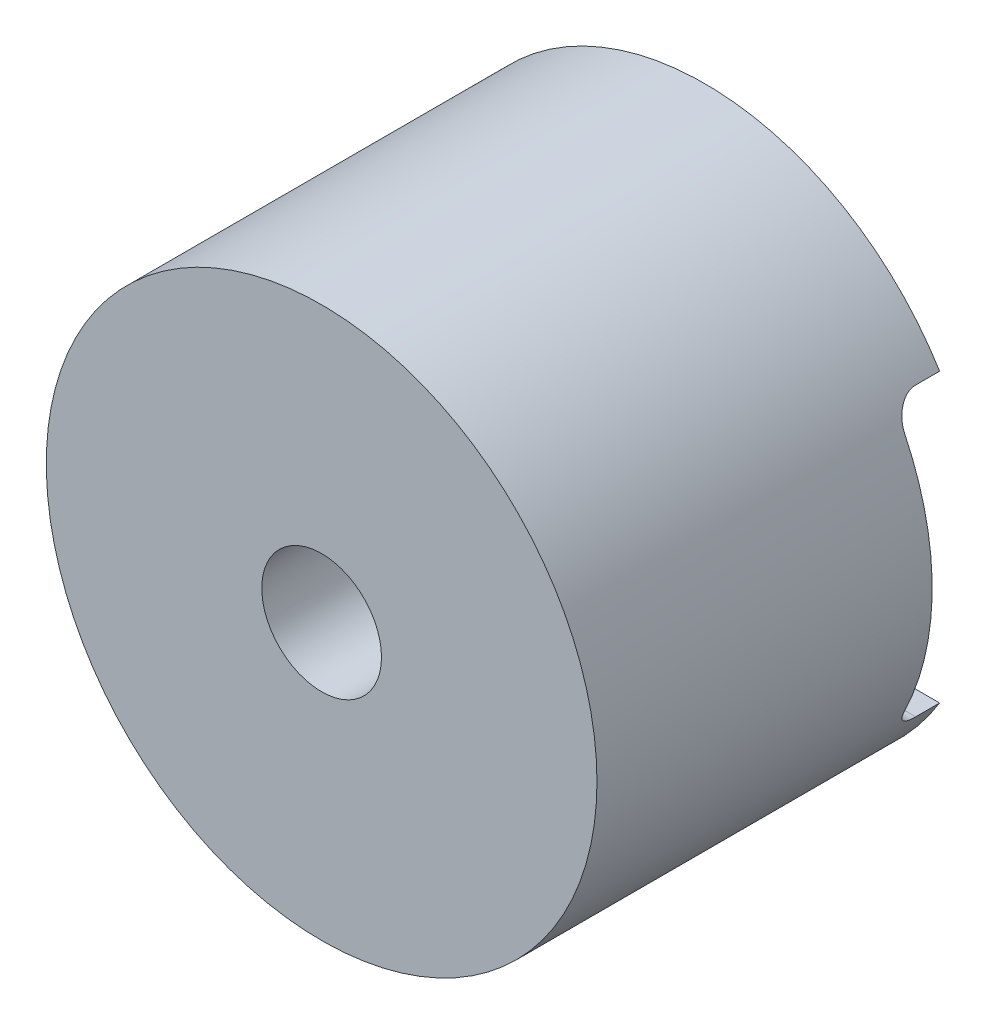
ISO-10303-21;
HEADER;
FILE_DESCRIPTION(('STEP AP214'),'2;1');
FILE_NAME('part.step','',(''),(''),'','','');
FILE_SCHEMA(('AUTOMOTIVE_DESIGN { 1 0 10303 214 1 1 1 1 }'));
ENDSEC;
DATA;
#1=APPLICATION_CONTEXT('core data for automotive mechanical design processes');
#2=APPLICATION_PROTOCOL_DEFINITION('international standard','automotive_design',2000,#1);
#3=PRODUCT_CONTEXT('',#1,'mechanical');
#4=PRODUCT('Part','Part','',(#3));
#5=PRODUCT_RELATED_PRODUCT_CATEGORY('part','',(#4));
#6=PRODUCT_DEFINITION_FORMATION('','',#4);
#7=PRODUCT_DEFINITION_CONTEXT('part definition',#1,'design');
#8=PRODUCT_DEFINITION('design','',#6,#7);
#9=PRODUCT_DEFINITION_SHAPE('','',#8);
#10=(LENGTH_UNIT() NAMED_UNIT(*) SI_UNIT(.MILLI.,.METRE.));
#11=(NAMED_UNIT(*) PLANE_ANGLE_UNIT() SI_UNIT($,.RADIAN.));
#12=(NAMED_UNIT(*) SI_UNIT($,.STERADIAN.) SOLID_ANGLE_UNIT());
#13=UNCERTAINTY_MEASURE_WITH_UNIT(LENGTH_MEASURE(1.E-05),#10,'distance_accuracy_value','');
#14=(GEOMETRIC_REPRESENTATION_CONTEXT(3) GLOBAL_UNCERTAINTY_ASSIGNED_CONTEXT((#13)) GLOBAL_UNIT_ASSIGNED_CONTEXT((#10,
#11,#12)) REPRESENTATION_CONTEXT('',''));
#15=CARTESIAN_POINT('',(0.,0.,0.));
#16=DIRECTION('',(0.,0.,1.));
#17=DIRECTION('',(1.,0.,0.));
#18=AXIS2_PLACEMENT_3D('',#15,#16,#17);
#19=CARTESIAN_POINT('',(0.,0.,1.));
#20=DIRECTION('',(0.,0.,-1.));
#21=DIRECTION('',(-1.,0.,0.));
#22=AXIS2_PLACEMENT_3D('',#19,#20,#21);
#23=PLANE('',#22);
#24=CARTESIAN_POINT('',(0.,0.,1.));
#25=DIRECTION('',(0.,0.,-1.));
#26=DIRECTION('',(-1.,0.,0.));
#27=AXIS2_PLACEMENT_3D('',#24,#25,#26);
#28=CIRCLE('',#27,4.5);
#29=CARTESIAN_POINT('',(3.74165738677394,2.5,1.));
#30=VERTEX_POINT('',#29);
#31=CARTESIAN_POINT('',(3.74165738677394,-2.5,1.));
#32=VERTEX_POINT('',#31);
#33=EDGE_CURVE('E146',#30,#32,#28,.T.);
#34=ORIENTED_EDGE('',*,*,#33,.F.);
#35=DIRECTION('',(1.,0.,0.));
#36=VECTOR('',#35,1.);
#37=CARTESIAN_POINT('',(0.,2.5,1.));
#38=LINE('',#37,#36);
#39=CARTESIAN_POINT('',(5.178078794302,2.5,1.));
#40=VERTEX_POINT('',#39);
#41=EDGE_CURVE('E163',#30,#40,#38,.T.);
#42=ORIENTED_EDGE('',*,*,#41,.T.);
#43=CARTESIAN_POINT('',(0.,0.,1.));
#44=DIRECTION('',(0.,0.,1.));
#45=DIRECTION('',(1.,0.,0.));
#46=AXIS2_PLACEMENT_3D('',#43,#44,#45);
#47=CIRCLE('',#46,5.75);
#48=CARTESIAN_POINT('',(5.178078794302,-2.5,1.));
#49=VERTEX_POINT('',#48);
#50=EDGE_CURVE('E426',#49,#40,#47,.T.);
#51=ORIENTED_EDGE('',*,*,#50,.F.);
#52=DIRECTION('',(-1.,0.,0.));
#53=VECTOR('',#52,1.);
#54=CARTESIAN_POINT('',(0.,-2.5,1.));
#55=LINE('',#54,#53);
#56=EDGE_CURVE('E168',#49,#32,#55,.T.);
#57=ORIENTED_EDGE('',*,*,#56,.T.);
#58=EDGE_LOOP('',(#34,#42,#51,#57));
#59=FACE_BOUND('',#58,.T.);
#60=ADVANCED_FACE('F43',(#59),#23,.T.);
#61=CARTESIAN_POINT('',(0.,0.,0.));
#62=DIRECTION('',(0.,0.,1.));
#63=DIRECTION('',(1.,0.,0.));
#64=AXIS2_PLACEMENT_3D('',#61,#62,#63);
#65=PLANE('',#64);
#66=DIRECTION('',(-1.,0.,0.));
#67=VECTOR('',#66,1.);
#68=CARTESIAN_POINT('',(-6.67958311014207,-3.,0.));
#69=LINE('',#68,#67);
#70=CARTESIAN_POINT('',(4.90535421758715,-3.,0.));
#71=VERTEX_POINT('',#70);
#72=CARTESIAN_POINT('',(3.35410196624968,-3.,0.));
#73=VERTEX_POINT('',#72);
#74=EDGE_CURVE('E254',#71,#73,#69,.T.);
#75=ORIENTED_EDGE('',*,*,#74,.F.);
#76=CARTESIAN_POINT('',(0.,0.,0.));
#77=DIRECTION('',(0.,0.,1.));
#78=DIRECTION('',(1.,0.,0.));
#79=AXIS2_PLACEMENT_3D('',#76,#77,#78);
#80=CIRCLE('',#79,5.75);
#81=CARTESIAN_POINT('',(-4.90535421758715,-3.,0.));
#82=VERTEX_POINT('',#81);
#83=EDGE_CURVE('E256',#82,#71,#80,.T.);
#84=ORIENTED_EDGE('',*,*,#83,.F.);
#85=CARTESIAN_POINT('',(-3.35410196624968,-3.,0.));
#86=VERTEX_POINT('',#85);
#87=EDGE_CURVE('E261',#86,#82,#69,.T.);
#88=ORIENTED_EDGE('',*,*,#87,.F.);
#89=CARTESIAN_POINT('',(0.,0.,0.));
#90=DIRECTION('',(0.,0.,-1.));
#91=DIRECTION('',(-1.,0.,0.));
#92=AXIS2_PLACEMENT_3D('',#89,#90,#91);
#93=CIRCLE('',#92,4.5);
#94=EDGE_CURVE('E259',#73,#86,#93,.T.);
#95=ORIENTED_EDGE('',*,*,#94,.F.);
#96=EDGE_LOOP('',(#75,#84,#88,#95));
#97=FACE_BOUND('',#96,.T.);
#98=ADVANCED_FACE('F241',(#97),#65,.F.);
#99=DIRECTION('',(1.,0.,0.));
#100=VECTOR('',#99,1.);
#101=CARTESIAN_POINT('',(-6.67958311014207,3.,0.));
#102=LINE('',#101,#100);
#103=CARTESIAN_POINT('',(-4.90535421758715,3.,0.));
#104=VERTEX_POINT('',#103);
#105=CARTESIAN_POINT('',(-3.35410196624968,3.,0.));
#106=VERTEX_POINT('',#105);
#107=EDGE_CURVE('E408',#104,#106,#102,.T.);
#108=ORIENTED_EDGE('',*,*,#107,.F.);
#109=CARTESIAN_POINT('',(4.90535421758715,3.,0.));
#110=VERTEX_POINT('',#109);
#111=EDGE_CURVE('E271',#110,#104,#80,.T.);
#112=ORIENTED_EDGE('',*,*,#111,.F.);
#113=CARTESIAN_POINT('',(3.35410196624968,3.,0.));
#114=VERTEX_POINT('',#113);
#115=EDGE_CURVE('E257',#114,#110,#102,.T.);
#116=ORIENTED_EDGE('',*,*,#115,.F.);
#117=EDGE_CURVE('E275',#106,#114,#93,.T.);
#118=ORIENTED_EDGE('',*,*,#117,.F.);
#119=EDGE_LOOP('',(#108,#112,#116,#118));
#120=FACE_BOUND('',#119,.T.);
#121=ADVANCED_FACE('F242',(#120),#65,.F.);
#122=CARTESIAN_POINT('',(0.,0.,8.));
#123=DIRECTION('',(0.,0.,-1.));
#124=DIRECTION('',(-1.,0.,0.));
#125=AXIS2_PLACEMENT_3D('',#122,#123,#124);
#126=CYLINDRICAL_SURFACE('',#125,5.75);
#127=ORIENTED_EDGE('',*,*,#111,.T.);
#128=DIRECTION('',(0.,0.,-1.));
#129=VECTOR('',#128,1.);
#130=CARTESIAN_POINT('',(-4.90535421758715,3.,8.));
#131=LINE('',#130,#129);
#132=CARTESIAN_POINT('',(-4.90535421758715,3.,0.5));
#133=VERTEX_POINT('',#132);
#134=EDGE_CURVE('E423',#104,#133,#131,.F.);
#135=ORIENTED_EDGE('',*,*,#134,.T.);
#136=CARTESIAN_POINT('',(-4.90535421758715,3.,0.5));
#137=CARTESIAN_POINT('',(-4.90532801108761,3.00003352669518,0.525346957454746));
#138=CARTESIAN_POINT('',(-4.90653149160759,2.99807509659698,0.550658668009895));
#139=CARTESIAN_POINT('',(-4.91118382175395,2.99045275931379,0.600380359194122));
#140=CARTESIAN_POINT('',(-4.9146213725958,2.98480749753717,0.624794227696451));
#141=CARTESIAN_POINT('',(-4.92352620251217,2.97009403840713,0.672128405260374));
#142=CARTESIAN_POINT('',(-4.92899098179319,2.96103005647845,0.695050513076731));
#143=CARTESIAN_POINT('',(-4.94163598151607,2.9398786340639,0.738958164216219));
#144=CARTESIAN_POINT('',(-4.94881803627487,2.92778795994783,0.759941603284304));
#145=CARTESIAN_POINT('',(-4.96505501815774,2.90017239268279,0.800847079910836));
#146=CARTESIAN_POINT('',(-4.97419925988442,2.88447946869383,0.820619618160841));
#147=CARTESIAN_POINT('',(-4.99365578227061,2.85066358617449,0.857292388887544));
#148=CARTESIAN_POINT('',(-5.00396842989955,2.83253986385594,0.874191714763773));
#149=CARTESIAN_POINT('',(-5.02690753950655,2.7916521749742,0.907086624891879));
#150=CARTESIAN_POINT('',(-5.03965642829471,2.76859334178177,0.922630658255236));
#151=CARTESIAN_POINT('',(-5.06578122197767,2.72049855944174,0.94960160063678));
#152=CARTESIAN_POINT('',(-5.07915754705472,2.69546127745472,0.961025704815717));
#153=CARTESIAN_POINT('',(-5.10689053157317,2.6425557908318,0.980115436507868));
#154=CARTESIAN_POINT('',(-5.12126071003556,2.61460763370695,0.987540445799408));
#155=CARTESIAN_POINT('',(-5.14986553962247,2.55781592957867,0.997482455196793));
#156=CARTESIAN_POINT('',(-5.16410029504209,2.5289731594334,1.00000359881657));
#157=CARTESIAN_POINT('',(-5.178078794302,2.5,1.));
#158=B_SPLINE_CURVE_WITH_KNOTS('',3,(#136,#137,#138,#139,#140,#141,#142,#143,#144,#145,#146,
#147,#148,#149,#150,#151,#152,#153,#154,#155,#156,#157),.UNSPECIFIED.,.F.,.F.,(4,2,2,2,2,2,2,2,
2,2,4),(0.,0.0758813183458636,0.151381823283267,0.22678953568167,0.302278157914572,
0.382509261613673,0.462765634278484,0.554169315106722,0.645635106420526,0.742119550217568,
0.838522434153712),.UNSPECIFIED.);
#159=CARTESIAN_POINT('',(-5.178078794302,2.5,1.));
#160=VERTEX_POINT('',#159);
#161=EDGE_CURVE('E160',#133,#160,#158,.T.);
#162=ORIENTED_EDGE('',*,*,#161,.T.);
#163=CARTESIAN_POINT('',(-5.178078794302,-2.5,1.));
#164=VERTEX_POINT('',#163);
#165=EDGE_CURVE('E162',#160,#164,#47,.T.);
#166=ORIENTED_EDGE('',*,*,#165,.T.);
#167=CARTESIAN_POINT('',(-5.178078794302,-2.5,1.));
#168=CARTESIAN_POINT('',(-5.1629507506291,-2.53136119370427,1.00000350042496));
#169=CARTESIAN_POINT('',(-5.14752127052535,-2.56256503398749,0.997050302461032));
#170=CARTESIAN_POINT('',(-5.11653000555348,-2.62388377874402,0.985414373331441));
#171=CARTESIAN_POINT('',(-5.10096804739912,-2.65399684525296,0.97672240654602));
#172=CARTESIAN_POINT('',(-5.07022738545424,-2.71226661048219,0.953788787231853));
#173=CARTESIAN_POINT('',(-5.05504886003746,-2.74042240897112,0.939544600641067));
#174=CARTESIAN_POINT('',(-5.02568022277324,-2.79391595809682,0.90572607246467));
#175=CARTESIAN_POINT('',(-5.01148974375641,-2.81925475767408,0.886153724304228));
#176=CARTESIAN_POINT('',(-4.98526884662045,-2.86535767054243,0.842754429917092));
#177=CARTESIAN_POINT('',(-4.97317990103583,-2.88625159946722,0.81910186501523));
#178=CARTESIAN_POINT('',(-4.95132477245517,-2.92358548811679,0.767552970629772));
#179=CARTESIAN_POINT('',(-4.94155690360651,-2.94002868173011,0.73965974553347));
#180=CARTESIAN_POINT('',(-4.92619735170116,-2.96568293204025,0.684254700282043));
#181=CARTESIAN_POINT('',(-4.92023128879219,-2.9755500531566,0.657150518085317));
#182=CARTESIAN_POINT('',(-4.91116420704493,-2.99049240302902,0.601232930239158));
#183=CARTESIAN_POINT('',(-4.90805418621006,-2.99558268907171,0.572425201729883));
#184=CARTESIAN_POINT('',(-4.90612218355424,-2.99874390115686,0.536161165284529));
#185=CARTESIAN_POINT('',(-4.90583425198355,-2.99921492913652,0.528935314433076));
#186=CARTESIAN_POINT('',(-4.90545061467947,-2.99984243570739,0.514474163094925));
#187=CARTESIAN_POINT('',(-4.90535466260382,-2.9999993174018,0.507238886654352));
#188=CARTESIAN_POINT('',(-4.90535421758715,-3.,0.5));
#189=B_SPLINE_CURVE_WITH_KNOTS('',3,(#167,#168,#169,#170,#171,#172,#173,#174,#175,#176,#177,
#178,#179,#180,#181,#182,#183,#184,#185,#186,#187,#188),.UNSPECIFIED.,.F.,.F.,(4,2,2,2,2,2,2,2,
2,2,4),(0.,0.104320256508361,0.208808810155369,0.313345108867513,0.417842351035308,
0.518654454267906,0.619393109943038,0.707245340119195,0.794819707671767,0.816554734377012,
0.838261853423487),.UNSPECIFIED.);
#190=CARTESIAN_POINT('',(-4.90535421758715,-3.,0.5));
#191=VERTEX_POINT('',#190);
#192=EDGE_CURVE('E216',#164,#191,#189,.T.);
#193=ORIENTED_EDGE('',*,*,#192,.T.);
#194=DIRECTION('',(0.,0.,-1.));
#195=VECTOR('',#194,1.);
#196=CARTESIAN_POINT('',(-4.90535421758715,-3.,8.));
#197=LINE('',#196,#195);
#198=EDGE_CURVE('E267',#191,#82,#197,.T.);
#199=ORIENTED_EDGE('',*,*,#198,.T.);
#200=ORIENTED_EDGE('',*,*,#83,.T.);
#201=DIRECTION('',(0.,0.,-1.));
#202=VECTOR('',#201,1.);
#203=CARTESIAN_POINT('',(4.90535421758715,-3.,8.));
#204=LINE('',#203,#202);
#205=CARTESIAN_POINT('',(4.90535421758715,-3.,0.5));
#206=VERTEX_POINT('',#205);
#207=EDGE_CURVE('E266',#71,#206,#204,.F.);
#208=ORIENTED_EDGE('',*,*,#207,.T.);
#209=CARTESIAN_POINT('',(4.90535421758715,-3.,0.5));
#210=CARTESIAN_POINT('',(4.90532801108761,-3.00003352669518,0.525346957454746));
#211=CARTESIAN_POINT('',(4.90653149160759,-2.99807509659698,0.550658668009895));
#212=CARTESIAN_POINT('',(4.91118382175395,-2.99045275931379,0.600380359194122));
#213=CARTESIAN_POINT('',(4.9146213725958,-2.98480749753717,0.624794227696452));
#214=CARTESIAN_POINT('',(4.92352620251217,-2.97009403840713,0.672128405260374));
#215=CARTESIAN_POINT('',(4.92899098179319,-2.96103005647845,0.695050513076731));
#216=CARTESIAN_POINT('',(4.94163598151607,-2.9398786340639,0.738958164216218));
#217=CARTESIAN_POINT('',(4.94881803627487,-2.92778795994783,0.759941603284304));
#218=CARTESIAN_POINT('',(4.96505501815774,-2.90017239268279,0.800847079910836));
#219=CARTESIAN_POINT('',(4.97419925988442,-2.88447946869383,0.820619618160841));
#220=CARTESIAN_POINT('',(4.99365578227061,-2.85066358617449,0.857292388887543));
#221=CARTESIAN_POINT('',(5.00396842989955,-2.83253986385594,0.874191714763773));
#222=CARTESIAN_POINT('',(5.02690753950655,-2.7916521749742,0.907086624891878));
#223=CARTESIAN_POINT('',(5.03965642829471,-2.76859334178177,0.922630658255236));
#224=CARTESIAN_POINT('',(5.06578122197767,-2.72049855944174,0.94960160063678));
#225=CARTESIAN_POINT('',(5.07915754705473,-2.69546127745472,0.961025704815717));
#226=CARTESIAN_POINT('',(5.10689053157317,-2.6425557908318,0.980115436507868));
#227=CARTESIAN_POINT('',(5.12126071003556,-2.61460763370695,0.987540445799408));
#228=CARTESIAN_POINT('',(5.14986553962247,-2.55781592957867,0.997482455196793));
#229=CARTESIAN_POINT('',(5.1641002950421,-2.5289731594334,1.00000359881657));
#230=CARTESIAN_POINT('',(5.178078794302,-2.5,1.));
#231=B_SPLINE_CURVE_WITH_KNOTS('',3,(#209,#210,#211,#212,#213,#214,#215,#216,#217,#218,#219,
#220,#221,#222,#223,#224,#225,#226,#227,#228,#229,#230),.UNSPECIFIED.,.F.,.F.,(4,2,2,2,2,2,2,2,
2,2,4),(0.,0.0758813183458637,0.151381823283267,0.22678953568167,0.302278157914572,
0.382509261613673,0.462765634278484,0.554169315106721,0.645635106420525,0.742119550217568,
0.838522434153712),.UNSPECIFIED.);
#232=EDGE_CURVE('E11',#206,#49,#231,.T.);
#233=ORIENTED_EDGE('',*,*,#232,.T.);
#234=ORIENTED_EDGE('',*,*,#50,.T.);
#235=CARTESIAN_POINT('',(5.178078794302,2.5,1.));
#236=CARTESIAN_POINT('',(5.1629507506291,2.53136119370427,1.00000350042496));
#237=CARTESIAN_POINT('',(5.14752127052535,2.56256503398749,0.997050302461032));
#238=CARTESIAN_POINT('',(5.11653000555348,2.62388377874402,0.985414373331441));
#239=CARTESIAN_POINT('',(5.10096804739912,2.65399684525296,0.97672240654602));
#240=CARTESIAN_POINT('',(5.07022738545424,2.71226661048219,0.953788787231854));
#241=CARTESIAN_POINT('',(5.05504886003746,2.74042240897112,0.939544600641067));
#242=CARTESIAN_POINT('',(5.02568022277324,2.79391595809683,0.905726072464671));
#243=CARTESIAN_POINT('',(5.0114897437564,2.81925475767409,0.886153724304228));
#244=CARTESIAN_POINT('',(4.98526884662045,2.86535767054243,0.842754429917092));
#245=CARTESIAN_POINT('',(4.97317990103583,2.88625159946722,0.81910186501523));
#246=CARTESIAN_POINT('',(4.95132477245517,2.92358548811679,0.767552970629772));
#247=CARTESIAN_POINT('',(4.94155690360651,2.94002868173011,0.739659745533469));
#248=CARTESIAN_POINT('',(4.92619735170116,2.96568293204025,0.684254700282043));
#249=CARTESIAN_POINT('',(4.92023128879219,2.9755500531566,0.657150518085317));
#250=CARTESIAN_POINT('',(4.91116420704493,2.99049240302902,0.601232930239158));
#251=CARTESIAN_POINT('',(4.90805418621006,2.99558268907171,0.572425201729883));
#252=CARTESIAN_POINT('',(4.90612218355424,2.99874390115686,0.536161165284529));
#253=CARTESIAN_POINT('',(4.90583425198355,2.99921492913652,0.528935314433076));
#254=CARTESIAN_POINT('',(4.90545061467947,2.99984243570739,0.514474163094925));
#255=CARTESIAN_POINT('',(4.90535466260382,2.9999993174018,0.507238886654352));
#256=CARTESIAN_POINT('',(4.90535421758715,3.,0.5));
#257=B_SPLINE_CURVE_WITH_KNOTS('',3,(#235,#236,#237,#238,#239,#240,#241,#242,#243,#244,#245,
#246,#247,#248,#249,#250,#251,#252,#253,#254,#255,#256),.UNSPECIFIED.,.F.,.F.,(4,2,2,2,2,2,2,2,
2,2,4),(0.,0.104320256508361,0.208808810155369,0.313345108867513,0.417842351035308,
0.518654454267907,0.619393109943039,0.707245340119196,0.794819707671766,0.816554734377012,
0.838261853423487),.UNSPECIFIED.);
#258=CARTESIAN_POINT('',(4.90535421758715,3.,0.5));
#259=VERTEX_POINT('',#258);
#260=EDGE_CURVE('E178',#40,#259,#257,.T.);
#261=ORIENTED_EDGE('',*,*,#260,.T.);
#262=DIRECTION('',(0.,0.,-1.));
#263=VECTOR('',#262,1.);
#264=CARTESIAN_POINT('',(4.90535421758715,3.,8.));
#265=LINE('',#264,#263);
#266=EDGE_CURVE('E424',#259,#110,#265,.T.);
#267=ORIENTED_EDGE('',*,*,#266,.T.);
#268=EDGE_LOOP('',(#127,#135,#162,#166,#193,#199,#200,#208,#233,#234,#261,#267));
#269=FACE_BOUND('',#268,.T.);
#270=CARTESIAN_POINT('',(0.,0.,8.));
#271=DIRECTION('',(0.,0.,1.));
#272=DIRECTION('',(1.,0.,0.));
#273=AXIS2_PLACEMENT_3D('',#270,#271,#272);
#274=CIRCLE('',#273,5.75);
#275=CARTESIAN_POINT('',(5.75,0.,8.));
#276=VERTEX_POINT('',#275);
#277=EDGE_CURVE('E273',#276,#276,#274,.T.);
#278=ORIENTED_EDGE('',*,*,#277,.F.);
#279=EDGE_LOOP('',(#278));
#280=FACE_BOUND('',#279,.T.);
#281=ADVANCED_FACE('F191',(#269,#280),#126,.T.);
#282=CARTESIAN_POINT('',(0.,0.,8.));
#283=DIRECTION('',(0.,0.,1.));
#284=DIRECTION('',(1.,0.,0.));
#285=AXIS2_PLACEMENT_3D('',#282,#283,#284);
#286=PLANE('',#285);
#287=CARTESIAN_POINT('',(0.,0.,8.));
#288=DIRECTION('',(0.,0.,1.));
#289=DIRECTION('',(1.,0.,0.));
#290=AXIS2_PLACEMENT_3D('',#287,#288,#289);
#291=CIRCLE('',#290,1.25);
#292=CARTESIAN_POINT('',(1.25,0.,8.));
#293=VERTEX_POINT('',#292);
#294=EDGE_CURVE('E398',#293,#293,#291,.T.);
#295=ORIENTED_EDGE('',*,*,#294,.F.);
#296=EDGE_LOOP('',(#295));
#297=FACE_BOUND('',#296,.T.);
#298=ORIENTED_EDGE('',*,*,#277,.T.);
#299=EDGE_LOOP('',(#298));
#300=FACE_BOUND('',#299,.T.);
#301=ADVANCED_FACE('F233',(#297,#300),#286,.T.);
#302=CARTESIAN_POINT('',(0.,0.,1.));
#303=DIRECTION('',(0.,0.,-1.));
#304=DIRECTION('',(-1.,0.,0.));
#305=AXIS2_PLACEMENT_3D('',#302,#303,#304);
#306=CYLINDRICAL_SURFACE('',#305,4.5);
#307=ORIENTED_EDGE('',*,*,#94,.T.);
#308=DIRECTION('',(0.,0.,-1.));
#309=VECTOR('',#308,1.);
#310=CARTESIAN_POINT('',(-3.35410196624968,-3.,1.));
#311=LINE('',#310,#309);
#312=CARTESIAN_POINT('',(-3.35410196624968,-3.,0.5));
#313=VERTEX_POINT('',#312);
#314=EDGE_CURVE('E412',#86,#313,#311,.F.);
#315=ORIENTED_EDGE('',*,*,#314,.T.);
#316=CARTESIAN_POINT('',(-3.35410196624968,-3.,0.5));
#317=CARTESIAN_POINT('',(-3.35406142901342,-3.00003707280073,0.523421990095812));
#318=CARTESIAN_POINT('',(-3.35557172993686,-2.99835700671142,0.546785579285448));
#319=CARTESIAN_POINT('',(-3.36134243853074,-2.99189038742696,0.592535313652234));
#320=CARTESIAN_POINT('',(-3.36557955910378,-2.98713013720991,0.61492803758768));
#321=CARTESIAN_POINT('',(-3.3764480030986,-2.97483802580343,0.658233520066025));
#322=CARTESIAN_POINT('',(-3.38307277982507,-2.96731374221986,0.67915014019497));
#323=CARTESIAN_POINT('',(-3.39827061383885,-2.94989690153646,0.719252467956002));
#324=CARTESIAN_POINT('',(-3.40684825929982,-2.93999876420587,0.73843394823951));
#325=CARTESIAN_POINT('',(-3.42905423421919,-2.91409937375112,0.781740221603727));
#326=CARTESIAN_POINT('',(-3.44336453858143,-2.89720694614725,0.804982405632034));
#327=CARTESIAN_POINT('',(-3.47389826881531,-2.86052483475188,0.847583724361713));
#328=CARTESIAN_POINT('',(-3.49012416494282,-2.84073140184668,0.866937756299992));
#329=CARTESIAN_POINT('',(-3.52406795287414,-2.79851581131791,0.902063686517552));
#330=CARTESIAN_POINT('',(-3.54180725765422,-2.77605314118168,0.91776570719207));
#331=CARTESIAN_POINT('',(-3.57794908022727,-2.7293142116642,0.945138598175633));
#332=CARTESIAN_POINT('',(-3.59635142953021,-2.70503841136876,0.956810484737043));
#333=CARTESIAN_POINT('',(-3.63606818982199,-2.65146454743795,0.97749180494263));
#334=CARTESIAN_POINT('',(-3.65741859561349,-2.62194810968917,0.98587141828879));
#335=CARTESIAN_POINT('',(-3.69986605586762,-2.56171493388835,0.997117842712156));
#336=CARTESIAN_POINT('',(-3.72096313815633,-2.53099832927379,0.99998526487866));
#337=CARTESIAN_POINT('',(-3.74165738677394,-2.5,1.));
#338=B_SPLINE_CURVE_WITH_KNOTS('',3,(#316,#317,#318,#319,#320,#321,#322,#323,#324,#325,#326,
#327,#328,#329,#330,#331,#332,#333,#334,#335,#336,#337),.UNSPECIFIED.,.F.,.F.,(4,2,2,2,2,2,2,2,
2,2,4),(0.,0.0700646876101446,0.139538821584028,0.208823896366987,0.278273464473019,
0.374050769010507,0.469952960969569,0.567561841324199,0.665146090284482,0.776853628931355,
0.888548782808417),.UNSPECIFIED.);
#339=CARTESIAN_POINT('',(-3.74165738677394,-2.5,1.));
#340=VERTEX_POINT('',#339);
#341=EDGE_CURVE('E141',#313,#340,#338,.T.);
#342=ORIENTED_EDGE('',*,*,#341,.T.);
#343=CARTESIAN_POINT('',(-3.74165738677394,2.5,1.));
#344=VERTEX_POINT('',#343);
#345=EDGE_CURVE('E133',#340,#344,#28,.T.);
#346=ORIENTED_EDGE('',*,*,#345,.T.);
#347=CARTESIAN_POINT('',(-3.74165738677394,2.5,1.));
#348=CARTESIAN_POINT('',(-3.71812393470497,2.53526456471844,0.99997326299213));
#349=CARTESIAN_POINT('',(-3.69406229741014,2.57015673092361,0.996270034027187));
#350=CARTESIAN_POINT('',(-3.64556246855422,2.63848106157201,0.98172301210589));
#351=CARTESIAN_POINT('',(-3.62112287124277,2.67190292699338,0.97083544361192));
#352=CARTESIAN_POINT('',(-3.57354001936119,2.73520593223834,0.942544743182));
#353=CARTESIAN_POINT('',(-3.55037965237317,2.76516051970923,0.92533477485915));
#354=CARTESIAN_POINT('',(-3.50568998466256,2.82159894704338,0.884426515402114));
#355=CARTESIAN_POINT('',(-3.48415623564038,2.84809240855342,0.860746802535286));
#356=CARTESIAN_POINT('',(-3.45053600867032,2.8886435090169,0.815532567373732));
#357=CARTESIAN_POINT('',(-3.4376312396989,2.9039679103306,0.795735725701357));
#358=CARTESIAN_POINT('',(-3.41384582881545,2.93189209354617,0.75320694859449));
#359=CARTESIAN_POINT('',(-3.402962543121,2.94449543771816,0.730478913601675));
#360=CARTESIAN_POINT('',(-3.3856558995845,2.96436787533223,0.686641197942039));
#361=CARTESIAN_POINT('',(-3.37878393338685,2.97218651629076,0.665958856718228));
#362=CARTESIAN_POINT('',(-3.36737585145436,2.98510550173043,0.623163959851751));
#363=CARTESIAN_POINT('',(-3.36283494778448,2.99021141882853,0.60105444166302));
#364=CARTESIAN_POINT('',(-3.3578140187486,2.99584586736016,0.565634729631951));
#365=CARTESIAN_POINT('',(-3.35642782199865,2.99739812192188,0.552604866479628));
#366=CARTESIAN_POINT('',(-3.35456961660389,2.99947718114637,0.526386471919608));
#367=CARTESIAN_POINT('',(-3.35409851093328,3.00000297294051,0.513197796698209));
#368=CARTESIAN_POINT('',(-3.35410196624968,3.,0.5));
#369=B_SPLINE_CURVE_WITH_KNOTS('',3,(#347,#348,#349,#350,#351,#352,#353,#354,#355,#356,#357,
#358,#359,#360,#361,#362,#363,#364,#365,#366,#367,#368),.UNSPECIFIED.,.F.,.F.,(4,2,2,2,2,2,2,2,
2,2,4),(0.,0.12701262454636,0.254806397042161,0.378982648508336,0.502806001444522,
0.587012173134451,0.671107428783728,0.740295059651323,0.809340006736803,0.848858748995281,
0.888416466951994),.UNSPECIFIED.);
#370=CARTESIAN_POINT('',(-3.35410196624968,3.,0.5));
#371=VERTEX_POINT('',#370);
#372=EDGE_CURVE('E138',#344,#371,#369,.T.);
#373=ORIENTED_EDGE('',*,*,#372,.T.);
#374=DIRECTION('',(0.,0.,-1.));
#375=VECTOR('',#374,1.);
#376=CARTESIAN_POINT('',(-3.35410196624968,3.,1.));
#377=LINE('',#376,#375);
#378=EDGE_CURVE('E418',#371,#106,#377,.T.);
#379=ORIENTED_EDGE('',*,*,#378,.T.);
#380=ORIENTED_EDGE('',*,*,#117,.T.);
#381=DIRECTION('',(0.,0.,-1.));
#382=VECTOR('',#381,1.);
#383=CARTESIAN_POINT('',(3.35410196624968,3.,1.));
#384=LINE('',#383,#382);
#385=CARTESIAN_POINT('',(3.35410196624968,3.,0.5));
#386=VERTEX_POINT('',#385);
#387=EDGE_CURVE('E416',#114,#386,#384,.F.);
#388=ORIENTED_EDGE('',*,*,#387,.T.);
#389=CARTESIAN_POINT('',(3.35410196624968,3.,0.5));
#390=CARTESIAN_POINT('',(3.35406142901342,3.00003707280073,0.523421990095812));
#391=CARTESIAN_POINT('',(3.35557172993686,2.99835700671143,0.546785579285448));
#392=CARTESIAN_POINT('',(3.36134243853074,2.99189038742696,0.592535313652234));
#393=CARTESIAN_POINT('',(3.36557955910378,2.98713013720991,0.614928037587679));
#394=CARTESIAN_POINT('',(3.3764480030986,2.97483802580344,0.658233520066025));
#395=CARTESIAN_POINT('',(3.38307277982507,2.96731374221986,0.679150140194971));
#396=CARTESIAN_POINT('',(3.39827061383885,2.94989690153646,0.719252467956002));
#397=CARTESIAN_POINT('',(3.40684825929982,2.93999876420587,0.738433948239509));
#398=CARTESIAN_POINT('',(3.42905423421919,2.91409937375112,0.781740221603727));
#399=CARTESIAN_POINT('',(3.44336453858143,2.89720694614725,0.804982405632034));
#400=CARTESIAN_POINT('',(3.47389826881531,2.86052483475188,0.847583724361714));
#401=CARTESIAN_POINT('',(3.49012416494282,2.84073140184668,0.866937756299992));
#402=CARTESIAN_POINT('',(3.52406795287414,2.79851581131791,0.902063686517552));
#403=CARTESIAN_POINT('',(3.54180725765422,2.77605314118168,0.91776570719207));
#404=CARTESIAN_POINT('',(3.57794908022727,2.7293142116642,0.945138598175632));
#405=CARTESIAN_POINT('',(3.59635142953021,2.70503841136877,0.956810484737043));
#406=CARTESIAN_POINT('',(3.63606818982199,2.65146454743795,0.97749180494263));
#407=CARTESIAN_POINT('',(3.65741859561348,2.62194810968917,0.98587141828879));
#408=CARTESIAN_POINT('',(3.69986605586762,2.56171493388836,0.997117842712156));
#409=CARTESIAN_POINT('',(3.72096313815633,2.53099832927379,0.99998526487866));
#410=CARTESIAN_POINT('',(3.74165738677394,2.5,1.));
#411=B_SPLINE_CURVE_WITH_KNOTS('',3,(#389,#390,#391,#392,#393,#394,#395,#396,#397,#398,#399,
#400,#401,#402,#403,#404,#405,#406,#407,#408,#409,#410),.UNSPECIFIED.,.F.,.F.,(4,2,2,2,2,2,2,2,
2,2,4),(0.,0.0700646876101446,0.139538821584028,0.208823896366987,0.278273464473019,
0.374050769010507,0.469952960969568,0.567561841324198,0.665146090284481,0.776853628931355,
0.888548782808417),.UNSPECIFIED.);
#412=EDGE_CURVE('E158',#386,#30,#411,.T.);
#413=ORIENTED_EDGE('',*,*,#412,.T.);
#414=ORIENTED_EDGE('',*,*,#33,.T.);
#415=CARTESIAN_POINT('',(3.74165738677394,-2.5,1.));
#416=CARTESIAN_POINT('',(3.71812393470497,-2.53526456471844,0.99997326299213));
#417=CARTESIAN_POINT('',(3.69406229741015,-2.57015673092361,0.996270034027187));
#418=CARTESIAN_POINT('',(3.64556246855422,-2.63848106157201,0.98172301210589));
#419=CARTESIAN_POINT('',(3.62112287124277,-2.67190292699338,0.97083544361192));
#420=CARTESIAN_POINT('',(3.57354001936119,-2.73520593223834,0.942544743182));
#421=CARTESIAN_POINT('',(3.55037965237317,-2.76516051970923,0.92533477485915));
#422=CARTESIAN_POINT('',(3.50568998466256,-2.82159894704338,0.884426515402114));
#423=CARTESIAN_POINT('',(3.48415623564039,-2.84809240855342,0.860746802535286));
#424=CARTESIAN_POINT('',(3.45053600867032,-2.88864350901689,0.815532567373732));
#425=CARTESIAN_POINT('',(3.4376312396989,-2.9039679103306,0.795735725701357));
#426=CARTESIAN_POINT('',(3.41384582881545,-2.93189209354617,0.75320694859449));
#427=CARTESIAN_POINT('',(3.402962543121,-2.94449543771816,0.730478913601675));
#428=CARTESIAN_POINT('',(3.3856558995845,-2.96436787533223,0.686641197942039));
#429=CARTESIAN_POINT('',(3.37878393338685,-2.97218651629075,0.665958856718228));
#430=CARTESIAN_POINT('',(3.36737585145436,-2.98510550173043,0.623163959851752));
#431=CARTESIAN_POINT('',(3.36283494778448,-2.99021141882853,0.601054441663021));
#432=CARTESIAN_POINT('',(3.3578140187486,-2.99584586736016,0.565634729631951));
#433=CARTESIAN_POINT('',(3.35642782199866,-2.99739812192187,0.552604866479628));
#434=CARTESIAN_POINT('',(3.35456961660389,-2.99947718114637,0.526386471919608));
#435=CARTESIAN_POINT('',(3.35409851093329,-3.00000297294051,0.513197796698209));
#436=CARTESIAN_POINT('',(3.35410196624968,-3.,0.5));
#437=B_SPLINE_CURVE_WITH_KNOTS('',3,(#415,#416,#417,#418,#419,#420,#421,#422,#423,#424,#425,
#426,#427,#428,#429,#430,#431,#432,#433,#434,#435,#436),.UNSPECIFIED.,.F.,.F.,(4,2,2,2,2,2,2,2,
2,2,4),(0.,0.127012624546361,0.254806397042162,0.378982648508336,0.502806001444522,
0.587012173134451,0.671107428783728,0.740295059651322,0.809340006736803,0.848858748995281,
0.888416466951994),.UNSPECIFIED.);
#438=CARTESIAN_POINT('',(3.35410196624968,-3.,0.5));
#439=VERTEX_POINT('',#438);
#440=EDGE_CURVE('E60',#32,#439,#437,.T.);
#441=ORIENTED_EDGE('',*,*,#440,.T.);
#442=DIRECTION('',(0.,0.,-1.));
#443=VECTOR('',#442,1.);
#444=CARTESIAN_POINT('',(3.35410196624968,-3.,1.));
#445=LINE('',#444,#443);
#446=EDGE_CURVE('E409',#439,#73,#445,.T.);
#447=ORIENTED_EDGE('',*,*,#446,.T.);
#448=EDGE_LOOP('',(#307,#315,#342,#346,#373,#379,#380,#388,#413,#414,#441,#447));
#449=FACE_BOUND('',#448,.T.);
#450=CARTESIAN_POINT('',(0.,0.,2.));
#451=DIRECTION('',(0.,0.,-1.));
#452=DIRECTION('',(-1.,0.,0.));
#453=AXIS2_PLACEMENT_3D('',#450,#451,#452);
#454=CIRCLE('',#453,4.5);
#455=CARTESIAN_POINT('',(-4.5,0.,2.));
#456=VERTEX_POINT('',#455);
#457=EDGE_CURVE('E399',#456,#456,#454,.T.);
#458=ORIENTED_EDGE('',*,*,#457,.F.);
#459=EDGE_LOOP('',(#458));
#460=FACE_BOUND('',#459,.T.);
#461=ADVANCED_FACE('F137',(#449,#460),#306,.F.);
#462=ORIENTED_EDGE('',*,*,#345,.F.);
#463=DIRECTION('',(-1.,0.,0.));
#464=VECTOR('',#463,1.);
#465=CARTESIAN_POINT('',(0.,-2.5,1.));
#466=LINE('',#465,#464);
#467=EDGE_CURVE('E164',#340,#164,#466,.T.);
#468=ORIENTED_EDGE('',*,*,#467,.T.);
#469=ORIENTED_EDGE('',*,*,#165,.F.);
#470=DIRECTION('',(1.,0.,0.));
#471=VECTOR('',#470,1.);
#472=CARTESIAN_POINT('',(0.,2.5,1.));
#473=LINE('',#472,#471);
#474=EDGE_CURVE('E154',#160,#344,#473,.T.);
#475=ORIENTED_EDGE('',*,*,#474,.T.);
#476=EDGE_LOOP('',(#462,#468,#469,#475));
#477=FACE_BOUND('',#476,.T.);
#478=ADVANCED_FACE('F161',(#477),#23,.T.);
#479=CARTESIAN_POINT('',(-6.67958311014207,-3.,1.));
#480=DIRECTION('',(0.,-1.,0.));
#481=DIRECTION('',(0.,0.,-1.));
#482=AXIS2_PLACEMENT_3D('',#479,#480,#481);
#483=PLANE('',#482);
#484=ORIENTED_EDGE('',*,*,#446,.F.);
#485=DIRECTION('',(-1.,0.,0.));
#486=VECTOR('',#485,1.);
#487=CARTESIAN_POINT('',(-6.67958311014207,-3.,0.5));
#488=LINE('',#487,#486);
#489=EDGE_CURVE('E63',#439,#206,#488,.F.);
#490=ORIENTED_EDGE('',*,*,#489,.T.);
#491=ORIENTED_EDGE('',*,*,#207,.F.);
#492=ORIENTED_EDGE('',*,*,#74,.T.);
#493=EDGE_LOOP('',(#484,#490,#491,#492));
#494=FACE_BOUND('',#493,.T.);
#495=ADVANCED_FACE('F294',(#494),#483,.F.);
#496=CARTESIAN_POINT('',(-6.67958311014207,3.,1.));
#497=DIRECTION('',(0.,1.,0.));
#498=DIRECTION('',(0.,0.,1.));
#499=AXIS2_PLACEMENT_3D('',#496,#497,#498);
#500=PLANE('',#499);
#501=ORIENTED_EDGE('',*,*,#266,.F.);
#502=DIRECTION('',(1.,0.,0.));
#503=VECTOR('',#502,1.);
#504=CARTESIAN_POINT('',(-6.67958311014207,3.,0.5));
#505=LINE('',#504,#503);
#506=EDGE_CURVE('E169',#259,#386,#505,.F.);
#507=ORIENTED_EDGE('',*,*,#506,.T.);
#508=ORIENTED_EDGE('',*,*,#387,.F.);
#509=ORIENTED_EDGE('',*,*,#115,.T.);
#510=EDGE_LOOP('',(#501,#507,#508,#509));
#511=FACE_BOUND('',#510,.T.);
#512=ADVANCED_FACE('F297',(#511),#500,.F.);
#513=ORIENTED_EDGE('',*,*,#378,.F.);
#514=DIRECTION('',(1.,0.,0.));
#515=VECTOR('',#514,1.);
#516=CARTESIAN_POINT('',(-6.67958311014207,3.,0.5));
#517=LINE('',#516,#515);
#518=EDGE_CURVE('E156',#371,#133,#517,.F.);
#519=ORIENTED_EDGE('',*,*,#518,.T.);
#520=ORIENTED_EDGE('',*,*,#134,.F.);
#521=ORIENTED_EDGE('',*,*,#107,.T.);
#522=EDGE_LOOP('',(#513,#519,#520,#521));
#523=FACE_BOUND('',#522,.T.);
#524=ADVANCED_FACE('F308',(#523),#500,.F.);
#525=ORIENTED_EDGE('',*,*,#198,.F.);
#526=DIRECTION('',(-1.,0.,0.));
#527=VECTOR('',#526,1.);
#528=CARTESIAN_POINT('',(-6.67958311014207,-3.,0.5));
#529=LINE('',#528,#527);
#530=EDGE_CURVE('E176',#191,#313,#529,.F.);
#531=ORIENTED_EDGE('',*,*,#530,.T.);
#532=ORIENTED_EDGE('',*,*,#314,.F.);
#533=ORIENTED_EDGE('',*,*,#87,.T.);
#534=EDGE_LOOP('',(#525,#531,#532,#533));
#535=FACE_BOUND('',#534,.T.);
#536=ADVANCED_FACE('F196',(#535),#483,.F.);
#537=CARTESIAN_POINT('',(0.,2.5,0.5));
#538=DIRECTION('',(1.,0.,0.));
#539=DIRECTION('',(0.,0.,-1.));
#540=AXIS2_PLACEMENT_3D('',#537,#538,#539);
#541=CYLINDRICAL_SURFACE('',#540,0.5);
#542=ORIENTED_EDGE('',*,*,#412,.F.);
#543=ORIENTED_EDGE('',*,*,#506,.F.);
#544=ORIENTED_EDGE('',*,*,#260,.F.);
#545=ORIENTED_EDGE('',*,*,#41,.F.);
#546=EDGE_LOOP('',(#542,#543,#544,#545));
#547=FACE_BOUND('',#546,.T.);
#548=ADVANCED_FACE('F193',(#547),#541,.F.);
#549=CARTESIAN_POINT('',(0.,2.5,0.5));
#550=DIRECTION('',(1.,0.,0.));
#551=DIRECTION('',(0.,0.,-1.));
#552=AXIS2_PLACEMENT_3D('',#549,#550,#551);
#553=CYLINDRICAL_SURFACE('',#552,0.5);
#554=ORIENTED_EDGE('',*,*,#161,.F.);
#555=ORIENTED_EDGE('',*,*,#518,.F.);
#556=ORIENTED_EDGE('',*,*,#372,.F.);
#557=ORIENTED_EDGE('',*,*,#474,.F.);
#558=EDGE_LOOP('',(#554,#555,#556,#557));
#559=FACE_BOUND('',#558,.T.);
#560=ADVANCED_FACE('F152',(#559),#553,.F.);
#561=CARTESIAN_POINT('',(0.,-2.5,0.5));
#562=DIRECTION('',(-1.,0.,0.));
#563=DIRECTION('',(0.,0.,1.));
#564=AXIS2_PLACEMENT_3D('',#561,#562,#563);
#565=CYLINDRICAL_SURFACE('',#564,0.5);
#566=ORIENTED_EDGE('',*,*,#341,.F.);
#567=ORIENTED_EDGE('',*,*,#530,.F.);
#568=ORIENTED_EDGE('',*,*,#192,.F.);
#569=ORIENTED_EDGE('',*,*,#467,.F.);
#570=EDGE_LOOP('',(#566,#567,#568,#569));
#571=FACE_BOUND('',#570,.T.);
#572=ADVANCED_FACE('F201',(#571),#565,.F.);
#573=CARTESIAN_POINT('',(0.,-2.5,0.5));
#574=DIRECTION('',(-1.,0.,0.));
#575=DIRECTION('',(0.,0.,1.));
#576=AXIS2_PLACEMENT_3D('',#573,#574,#575);
#577=CYLINDRICAL_SURFACE('',#576,0.5);
#578=ORIENTED_EDGE('',*,*,#232,.F.);
#579=ORIENTED_EDGE('',*,*,#489,.F.);
#580=ORIENTED_EDGE('',*,*,#440,.F.);
#581=ORIENTED_EDGE('',*,*,#56,.F.);
#582=EDGE_LOOP('',(#578,#579,#580,#581));
#583=FACE_BOUND('',#582,.T.);
#584=ADVANCED_FACE('F44',(#583),#577,.F.);
#585=CARTESIAN_POINT('',(0.,0.,5.));
#586=DIRECTION('',(0.,0.,1.));
#587=DIRECTION('',(1.,0.,0.));
#588=AXIS2_PLACEMENT_3D('',#585,#586,#587);
#589=CYLINDRICAL_SURFACE('',#588,1.25);
#590=CARTESIAN_POINT('',(0.,0.,5.));
#591=DIRECTION('',(0.,0.,1.));
#592=DIRECTION('',(1.,0.,0.));
#593=AXIS2_PLACEMENT_3D('',#590,#591,#592);
#594=CIRCLE('',#593,1.25);
#595=CARTESIAN_POINT('',(1.25,0.,5.));
#596=VERTEX_POINT('',#595);
#597=EDGE_CURVE('E405',#596,#596,#594,.T.);
#598=ORIENTED_EDGE('',*,*,#597,.F.);
#599=EDGE_LOOP('',(#598));
#600=FACE_BOUND('',#599,.T.);
#601=ORIENTED_EDGE('',*,*,#294,.T.);
#602=EDGE_LOOP('',(#601));
#603=FACE_BOUND('',#602,.T.);
#604=ADVANCED_FACE('F335',(#600,#603),#589,.F.);
#605=CARTESIAN_POINT('',(0.,0.,5.));
#606=DIRECTION('',(0.,0.,1.));
#607=DIRECTION('',(1.,0.,0.));
#608=AXIS2_PLACEMENT_3D('',#605,#606,#607);
#609=PLANE('',#608);
#610=ORIENTED_EDGE('',*,*,#597,.T.);
#611=EDGE_LOOP('',(#610));
#612=FACE_BOUND('',#611,.T.);
#613=ADVANCED_FACE('F336',(#612),#609,.T.);
#614=CARTESIAN_POINT('',(0.,0.,2.));
#615=DIRECTION('',(0.,0.,-1.));
#616=DIRECTION('',(-1.,0.,0.));
#617=AXIS2_PLACEMENT_3D('',#614,#615,#616);
#618=PLANE('',#617);
#619=ORIENTED_EDGE('',*,*,#457,.T.);
#620=EDGE_LOOP('',(#619));
#621=FACE_BOUND('',#620,.T.);
#622=ADVANCED_FACE('F345',(#621),#618,.T.);
#623=CLOSED_SHELL('',(#60,#98,#121,#281,#301,#461,#478,#495,#512,#524,#536,#548,#560,#572,#584,
#604,#613,#622));
#624=MANIFOLD_SOLID_BREP('B2',#623);
#625=ADVANCED_BREP_SHAPE_REPRESENTATION('',(#18,#624),#14);
#626=SHAPE_DEFINITION_REPRESENTATION(#9,#625);
ENDSEC;
END-ISO-10303-21;
